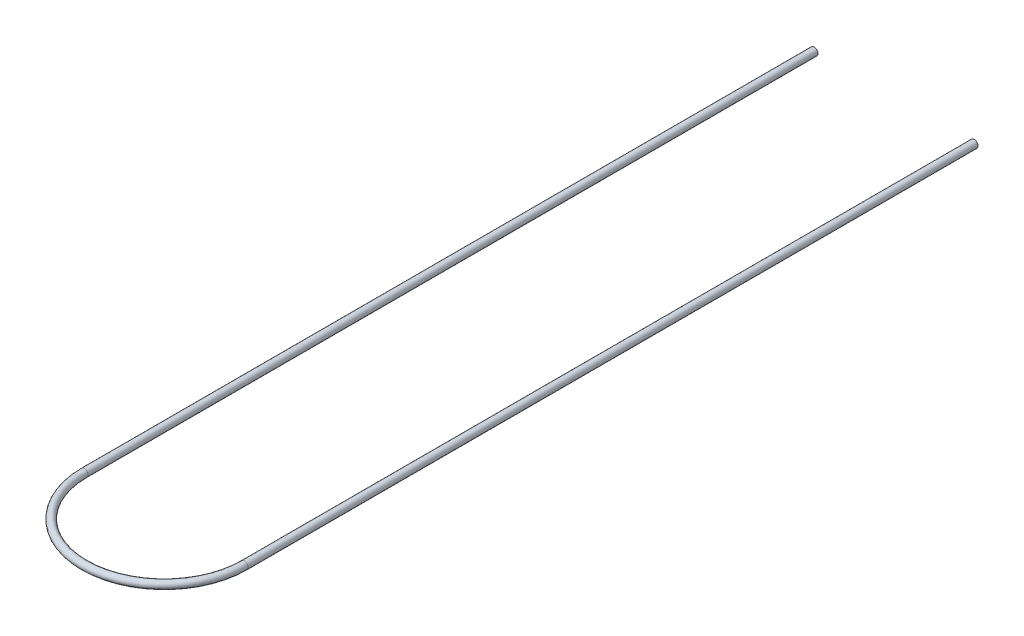
ISO-10303-21;
HEADER;
FILE_DESCRIPTION(('STEP AP214'),'2;1');
FILE_NAME('part.step','',(''),(''),'','','');
FILE_SCHEMA(('AUTOMOTIVE_DESIGN { 1 0 10303 214 1 1 1 1 }'));
ENDSEC;
DATA;
#1=APPLICATION_CONTEXT('core data for automotive mechanical design processes');
#2=APPLICATION_PROTOCOL_DEFINITION('international standard','automotive_design',2000,#1);
#3=PRODUCT_CONTEXT('',#1,'mechanical');
#4=PRODUCT('Part','Part','',(#3));
#5=PRODUCT_RELATED_PRODUCT_CATEGORY('part','',(#4));
#6=PRODUCT_DEFINITION_FORMATION('','',#4);
#7=PRODUCT_DEFINITION_CONTEXT('part definition',#1,'design');
#8=PRODUCT_DEFINITION('design','',#6,#7);
#9=PRODUCT_DEFINITION_SHAPE('','',#8);
#10=(LENGTH_UNIT() NAMED_UNIT(*) SI_UNIT(.MILLI.,.METRE.));
#11=(NAMED_UNIT(*) PLANE_ANGLE_UNIT() SI_UNIT($,.RADIAN.));
#12=(NAMED_UNIT(*) SI_UNIT($,.STERADIAN.) SOLID_ANGLE_UNIT());
#13=UNCERTAINTY_MEASURE_WITH_UNIT(LENGTH_MEASURE(1.E-05),#10,'distance_accuracy_value','');
#14=(GEOMETRIC_REPRESENTATION_CONTEXT(3) GLOBAL_UNCERTAINTY_ASSIGNED_CONTEXT((#13)) GLOBAL_UNIT_ASSIGNED_CONTEXT((#10,
#11,#12)) REPRESENTATION_CONTEXT('',''));
#15=CARTESIAN_POINT('',(0.,0.,0.));
#16=DIRECTION('',(0.,0.,1.));
#17=DIRECTION('',(1.,0.,0.));
#18=AXIS2_PLACEMENT_3D('',#15,#16,#17);
#19=CARTESIAN_POINT('',(-39.9999999999999,0.,299.999999999999));
#20=DIRECTION('',(0.,0.,1.));
#21=DIRECTION('',(1.,0.,0.));
#22=AXIS2_PLACEMENT_3D('',#19,#20,#21);
#23=CYLINDRICAL_SURFACE('',#22,11.1);
#24=CARTESIAN_POINT('',(-39.9999999999996,0.,2440.));
#25=DIRECTION('',(0.,0.,1.));
#26=DIRECTION('',(1.,0.,0.));
#27=AXIS2_PLACEMENT_3D('',#24,#25,#26);
#28=CIRCLE('',#27,11.1);
#29=CARTESIAN_POINT('',(-51.0999999999997,0.,2440.));
#30=VERTEX_POINT('',#29);
#31=EDGE_CURVE('E54',#30,#30,#28,.T.);
#32=ORIENTED_EDGE('',*,*,#31,.F.);
#33=EDGE_LOOP('',(#32));
#34=FACE_BOUND('',#33,.T.);
#35=CARTESIAN_POINT('',(-39.9999999999999,0.,299.999999999999));
#36=DIRECTION('',(0.,0.,1.));
#37=DIRECTION('',(1.,0.,0.));
#38=AXIS2_PLACEMENT_3D('',#35,#36,#37);
#39=CIRCLE('',#38,11.1);
#40=CARTESIAN_POINT('',(-28.9,0.,299.999999999999));
#41=VERTEX_POINT('',#40);
#42=EDGE_CURVE('E52',#41,#41,#39,.T.);
#43=ORIENTED_EDGE('',*,*,#42,.T.);
#44=EDGE_LOOP('',(#43));
#45=FACE_BOUND('',#44,.T.);
#46=ADVANCED_FACE('F31',(#34,#45),#23,.T.);
#47=CARTESIAN_POINT('',(194.615,0.,2440.));
#48=DIRECTION('',(0.,1.,0.));
#49=DIRECTION('',(0.,0.,1.));
#50=AXIS2_PLACEMENT_3D('',#47,#48,#49);
#51=TOROIDAL_SURFACE('',#50,234.615,11.1);
#52=CARTESIAN_POINT('',(429.23,0.,2440.));
#53=DIRECTION('',(0.,0.,-1.));
#54=DIRECTION('',(-1.,0.,0.));
#55=AXIS2_PLACEMENT_3D('',#52,#53,#54);
#56=CIRCLE('',#55,11.1);
#57=CARTESIAN_POINT('',(440.33,0.,2440.));
#58=VERTEX_POINT('',#57);
#59=EDGE_CURVE('E35',#58,#58,#56,.T.);
#60=CARTESIAN_POINT('',(194.615,0.,2440.));
#61=DIRECTION('',(0.,1.,0.));
#62=DIRECTION('',(0.,0.,1.));
#63=AXIS2_PLACEMENT_3D('',#60,#61,#62);
#64=CIRCLE('',#63,245.715);
#65=EDGE_CURVE('',#30,#58,#64,.T.);
#66=ORIENTED_EDGE('',*,*,#31,.T.);
#67=ORIENTED_EDGE('',*,*,#59,.F.);
#68=ORIENTED_EDGE('',*,*,#65,.T.);
#69=ORIENTED_EDGE('',*,*,#65,.F.);
#70=EDGE_LOOP('',(#66,#68,#67,#69));
#71=FACE_BOUND('',#70,.T.);
#72=ADVANCED_FACE('F62',(#71),#51,.T.);
#73=CARTESIAN_POINT('',(429.23,0.,2440.));
#74=DIRECTION('',(0.,0.,-1.));
#75=DIRECTION('',(-1.,0.,0.));
#76=AXIS2_PLACEMENT_3D('',#73,#74,#75);
#77=CYLINDRICAL_SURFACE('',#76,11.1);
#78=CARTESIAN_POINT('',(429.23,0.,299.999999999999));
#79=DIRECTION('',(0.,0.,-1.));
#80=DIRECTION('',(-1.,0.,0.));
#81=AXIS2_PLACEMENT_3D('',#78,#79,#80);
#82=CIRCLE('',#81,11.1);
#83=CARTESIAN_POINT('',(418.13,0.,299.999999999999));
#84=VERTEX_POINT('',#83);
#85=EDGE_CURVE('E48',#84,#84,#82,.T.);
#86=ORIENTED_EDGE('',*,*,#85,.F.);
#87=EDGE_LOOP('',(#86));
#88=FACE_BOUND('',#87,.T.);
#89=ORIENTED_EDGE('',*,*,#59,.T.);
#90=EDGE_LOOP('',(#89));
#91=FACE_BOUND('',#90,.T.);
#92=ADVANCED_FACE('F33',(#88,#91),#77,.T.);
#93=CARTESIAN_POINT('',(-39.9999999999999,0.,299.999999999999));
#94=DIRECTION('',(0.,0.,1.));
#95=DIRECTION('',(1.,0.,0.));
#96=AXIS2_PLACEMENT_3D('',#93,#94,#95);
#97=PLANE('',#96);
#98=CARTESIAN_POINT('',(-39.9999999999999,0.,299.999999999999));
#99=DIRECTION('',(0.,0.,1.));
#100=DIRECTION('',(1.,0.,0.));
#101=AXIS2_PLACEMENT_3D('',#98,#99,#100);
#102=CIRCLE('',#101,9.95000000000001);
#103=CARTESIAN_POINT('',(-30.0499999999999,0.,299.999999999999));
#104=VERTEX_POINT('',#103);
#105=EDGE_CURVE('E51',#104,#104,#102,.F.);
#106=ORIENTED_EDGE('',*,*,#105,.F.);
#107=EDGE_LOOP('',(#106));
#108=FACE_BOUND('',#107,.T.);
#109=ORIENTED_EDGE('',*,*,#42,.F.);
#110=EDGE_LOOP('',(#109));
#111=FACE_BOUND('',#110,.T.);
#112=ADVANCED_FACE('F68',(#108,#111),#97,.F.);
#113=CARTESIAN_POINT('',(429.23,0.,299.999999999999));
#114=DIRECTION('',(0.,0.,-1.));
#115=DIRECTION('',(-1.,0.,0.));
#116=AXIS2_PLACEMENT_3D('',#113,#114,#115);
#117=PLANE('',#116);
#118=CARTESIAN_POINT('',(429.23,0.,299.999999999999));
#119=DIRECTION('',(0.,0.,-1.));
#120=DIRECTION('',(-1.,0.,0.));
#121=AXIS2_PLACEMENT_3D('',#118,#119,#120);
#122=CIRCLE('',#121,9.95000000000001);
#123=CARTESIAN_POINT('',(419.28,0.,299.999999999999));
#124=VERTEX_POINT('',#123);
#125=EDGE_CURVE('E10',#124,#124,#122,.F.);
#126=ORIENTED_EDGE('',*,*,#125,.T.);
#127=EDGE_LOOP('',(#126));
#128=FACE_BOUND('',#127,.T.);
#129=ORIENTED_EDGE('',*,*,#85,.T.);
#130=EDGE_LOOP('',(#129));
#131=FACE_BOUND('',#130,.T.);
#132=ADVANCED_FACE('F86',(#128,#131),#117,.T.);
#133=CARTESIAN_POINT('',(-39.9999999999999,0.,299.999999999999));
#134=DIRECTION('',(0.,0.,1.));
#135=DIRECTION('',(1.,0.,0.));
#136=AXIS2_PLACEMENT_3D('',#133,#134,#135);
#137=CYLINDRICAL_SURFACE('',#136,9.95000000000001);
#138=CARTESIAN_POINT('',(-39.9999999999996,0.,2440.));
#139=DIRECTION('',(0.,0.,1.));
#140=DIRECTION('',(1.,0.,0.));
#141=AXIS2_PLACEMENT_3D('',#138,#139,#140);
#142=CIRCLE('',#141,9.95000000000001);
#143=CARTESIAN_POINT('',(-49.9499999999997,0.,2440.));
#144=VERTEX_POINT('',#143);
#145=EDGE_CURVE('E44',#144,#144,#142,.F.);
#146=ORIENTED_EDGE('',*,*,#145,.F.);
#147=EDGE_LOOP('',(#146));
#148=FACE_BOUND('',#147,.T.);
#149=ORIENTED_EDGE('',*,*,#105,.T.);
#150=EDGE_LOOP('',(#149));
#151=FACE_BOUND('',#150,.T.);
#152=ADVANCED_FACE('F80',(#148,#151),#137,.F.);
#153=CARTESIAN_POINT('',(194.615,0.,2440.));
#154=DIRECTION('',(0.,1.,0.));
#155=DIRECTION('',(0.,0.,1.));
#156=AXIS2_PLACEMENT_3D('',#153,#154,#155);
#157=TOROIDAL_SURFACE('',#156,234.615,9.95000000000001);
#158=CARTESIAN_POINT('',(429.23,0.,2440.));
#159=DIRECTION('',(0.,0.,-1.));
#160=DIRECTION('',(-1.,0.,0.));
#161=AXIS2_PLACEMENT_3D('',#158,#159,#160);
#162=CIRCLE('',#161,9.95000000000001);
#163=CARTESIAN_POINT('',(439.18,0.,2440.));
#164=VERTEX_POINT('',#163);
#165=EDGE_CURVE('E39',#164,#164,#162,.F.);
#166=CARTESIAN_POINT('',(194.615,0.,2440.));
#167=DIRECTION('',(0.,1.,0.));
#168=DIRECTION('',(0.,0.,1.));
#169=AXIS2_PLACEMENT_3D('',#166,#167,#168);
#170=CIRCLE('',#169,244.565);
#171=EDGE_CURVE('',#144,#164,#170,.T.);
#172=ORIENTED_EDGE('',*,*,#145,.T.);
#173=ORIENTED_EDGE('',*,*,#165,.F.);
#174=ORIENTED_EDGE('',*,*,#171,.T.);
#175=ORIENTED_EDGE('',*,*,#171,.F.);
#176=EDGE_LOOP('',(#172,#174,#173,#175));
#177=FACE_BOUND('',#176,.T.);
#178=ADVANCED_FACE('F74',(#177),#157,.F.);
#179=CARTESIAN_POINT('',(429.23,0.,2440.));
#180=DIRECTION('',(0.,0.,-1.));
#181=DIRECTION('',(-1.,0.,0.));
#182=AXIS2_PLACEMENT_3D('',#179,#180,#181);
#183=CYLINDRICAL_SURFACE('',#182,9.95000000000001);
#184=ORIENTED_EDGE('',*,*,#125,.F.);
#185=EDGE_LOOP('',(#184));
#186=FACE_BOUND('',#185,.T.);
#187=ORIENTED_EDGE('',*,*,#165,.T.);
#188=EDGE_LOOP('',(#187));
#189=FACE_BOUND('',#188,.T.);
#190=ADVANCED_FACE('F72',(#186,#189),#183,.F.);
#191=CLOSED_SHELL('',(#46,#72,#92,#112,#132,#152,#178,#190));
#192=MANIFOLD_SOLID_BREP('B2',#191);
#193=ADVANCED_BREP_SHAPE_REPRESENTATION('',(#18,#192),#14);
#194=SHAPE_DEFINITION_REPRESENTATION(#9,#193);
ENDSEC;
END-ISO-10303-21;
